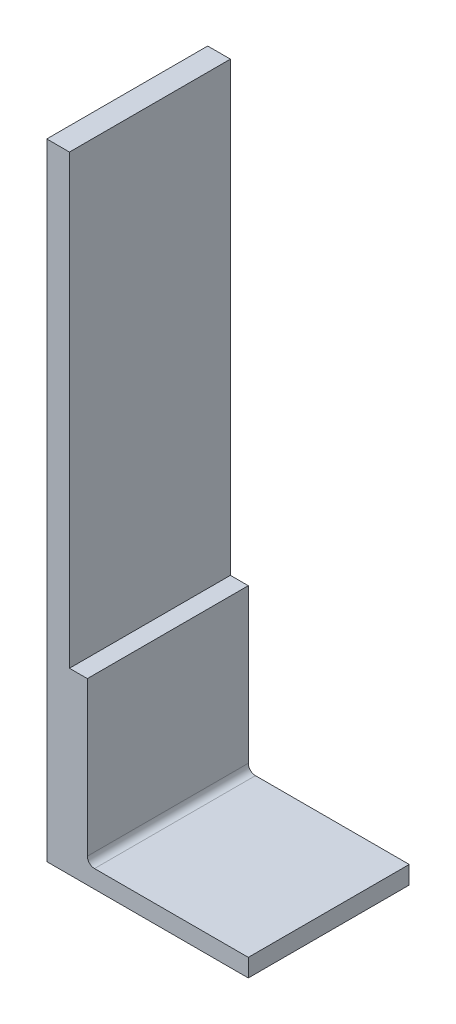
ISO-10303-21;
HEADER;
FILE_DESCRIPTION(('STEP AP214'),'2;1');
FILE_NAME('part.step','',(''),(''),'','','');
FILE_SCHEMA(('AUTOMOTIVE_DESIGN { 1 0 10303 214 1 1 1 1 }'));
ENDSEC;
DATA;
#1=APPLICATION_CONTEXT('core data for automotive mechanical design processes');
#2=APPLICATION_PROTOCOL_DEFINITION('international standard','automotive_design',2000,#1);
#3=PRODUCT_CONTEXT('',#1,'mechanical');
#4=PRODUCT('Part','Part','',(#3));
#5=PRODUCT_RELATED_PRODUCT_CATEGORY('part','',(#4));
#6=PRODUCT_DEFINITION_FORMATION('','',#4);
#7=PRODUCT_DEFINITION_CONTEXT('part definition',#1,'design');
#8=PRODUCT_DEFINITION('design','',#6,#7);
#9=PRODUCT_DEFINITION_SHAPE('','',#8);
#10=(LENGTH_UNIT() NAMED_UNIT(*) SI_UNIT(.MILLI.,.METRE.));
#11=(NAMED_UNIT(*) PLANE_ANGLE_UNIT() SI_UNIT($,.RADIAN.));
#12=(NAMED_UNIT(*) SI_UNIT($,.STERADIAN.) SOLID_ANGLE_UNIT());
#13=UNCERTAINTY_MEASURE_WITH_UNIT(LENGTH_MEASURE(1.E-05),#10,'distance_accuracy_value','');
#14=(GEOMETRIC_REPRESENTATION_CONTEXT(3) GLOBAL_UNCERTAINTY_ASSIGNED_CONTEXT((#13)) GLOBAL_UNIT_ASSIGNED_CONTEXT((#10,
#11,#12)) REPRESENTATION_CONTEXT('',''));
#15=CARTESIAN_POINT('',(0.,0.,0.));
#16=DIRECTION('',(0.,0.,1.));
#17=DIRECTION('',(1.,0.,0.));
#18=AXIS2_PLACEMENT_3D('',#15,#16,#17);
#19=CARTESIAN_POINT('',(0.,0.,90.));
#20=DIRECTION('',(0.,1.,0.));
#21=DIRECTION('',(0.,0.,1.));
#22=AXIS2_PLACEMENT_3D('',#19,#20,#21);
#23=PLANE('',#22);
#24=DIRECTION('',(1.,0.,0.));
#25=VECTOR('',#24,1.);
#26=CARTESIAN_POINT('',(0.,0.,0.));
#27=LINE('',#26,#25);
#28=CARTESIAN_POINT('',(-12.7,0.,0.));
#29=VERTEX_POINT('',#28);
#30=CARTESIAN_POINT('',(100.,0.,0.));
#31=VERTEX_POINT('',#30);
#32=EDGE_CURVE('E114',#29,#31,#27,.T.);
#33=ORIENTED_EDGE('',*,*,#32,.T.);
#34=DIRECTION('',(0.,0.,-1.));
#35=VECTOR('',#34,1.);
#36=CARTESIAN_POINT('',(100.,0.,90.));
#37=LINE('',#36,#35);
#38=CARTESIAN_POINT('',(100.,0.,90.));
#39=VERTEX_POINT('',#38);
#40=EDGE_CURVE('E11',#39,#31,#37,.T.);
#41=ORIENTED_EDGE('',*,*,#40,.F.);
#42=DIRECTION('',(1.,0.,0.));
#43=VECTOR('',#42,1.);
#44=CARTESIAN_POINT('',(0.,0.,90.));
#45=LINE('',#44,#43);
#46=CARTESIAN_POINT('',(-12.7,0.,90.));
#47=VERTEX_POINT('',#46);
#48=EDGE_CURVE('E127',#47,#39,#45,.T.);
#49=ORIENTED_EDGE('',*,*,#48,.F.);
#50=DIRECTION('',(0.,0.,1.));
#51=VECTOR('',#50,1.);
#52=CARTESIAN_POINT('',(-12.7,0.,0.));
#53=LINE('',#52,#51);
#54=EDGE_CURVE('E210',#29,#47,#53,.T.);
#55=ORIENTED_EDGE('',*,*,#54,.F.);
#56=EDGE_LOOP('',(#33,#41,#49,#55));
#57=FACE_BOUND('',#56,.T.);
#58=ADVANCED_FACE('F33',(#57),#23,.F.);
#59=CARTESIAN_POINT('',(100.,0.,90.));
#60=DIRECTION('',(-1.,0.,0.));
#61=DIRECTION('',(0.,0.,1.));
#62=AXIS2_PLACEMENT_3D('',#59,#60,#61);
#63=PLANE('',#62);
#64=DIRECTION('',(0.,1.,0.));
#65=VECTOR('',#64,1.);
#66=CARTESIAN_POINT('',(100.,0.,0.));
#67=LINE('',#66,#65);
#68=CARTESIAN_POINT('',(100.,10.,0.));
#69=VERTEX_POINT('',#68);
#70=EDGE_CURVE('E117',#31,#69,#67,.T.);
#71=ORIENTED_EDGE('',*,*,#70,.T.);
#72=DIRECTION('',(0.,0.,-1.));
#73=VECTOR('',#72,1.);
#74=CARTESIAN_POINT('',(100.,10.,90.));
#75=LINE('',#74,#73);
#76=CARTESIAN_POINT('',(100.,10.,90.));
#77=VERTEX_POINT('',#76);
#78=EDGE_CURVE('E41',#77,#69,#75,.T.);
#79=ORIENTED_EDGE('',*,*,#78,.F.);
#80=DIRECTION('',(0.,1.,0.));
#81=VECTOR('',#80,1.);
#82=CARTESIAN_POINT('',(100.,0.,90.));
#83=LINE('',#82,#81);
#84=EDGE_CURVE('E85',#39,#77,#83,.T.);
#85=ORIENTED_EDGE('',*,*,#84,.F.);
#86=ORIENTED_EDGE('',*,*,#40,.T.);
#87=EDGE_LOOP('',(#71,#79,#85,#86));
#88=FACE_BOUND('',#87,.T.);
#89=ADVANCED_FACE('F177',(#88),#63,.F.);
#90=CARTESIAN_POINT('',(14.,10.,90.));
#91=DIRECTION('',(0.,-1.,0.));
#92=DIRECTION('',(0.,0.,-1.));
#93=AXIS2_PLACEMENT_3D('',#90,#91,#92);
#94=PLANE('',#93);
#95=DIRECTION('',(-1.,0.,0.));
#96=VECTOR('',#95,1.);
#97=CARTESIAN_POINT('',(14.,10.,0.));
#98=LINE('',#97,#96);
#99=CARTESIAN_POINT('',(14.,10.,0.));
#100=VERTEX_POINT('',#99);
#101=EDGE_CURVE('E120',#69,#100,#98,.T.);
#102=ORIENTED_EDGE('',*,*,#101,.T.);
#103=DIRECTION('',(0.,0.,-1.));
#104=VECTOR('',#103,1.);
#105=CARTESIAN_POINT('',(14.,10.,90.));
#106=LINE('',#105,#104);
#107=CARTESIAN_POINT('',(14.,10.,90.));
#108=VERTEX_POINT('',#107);
#109=EDGE_CURVE('E105',#108,#100,#106,.T.);
#110=ORIENTED_EDGE('',*,*,#109,.F.);
#111=DIRECTION('',(-1.,0.,0.));
#112=VECTOR('',#111,1.);
#113=CARTESIAN_POINT('',(14.,10.,90.));
#114=LINE('',#113,#112);
#115=EDGE_CURVE('E100',#77,#108,#114,.T.);
#116=ORIENTED_EDGE('',*,*,#115,.F.);
#117=ORIENTED_EDGE('',*,*,#78,.T.);
#118=EDGE_LOOP('',(#102,#110,#116,#117));
#119=FACE_BOUND('',#118,.T.);
#120=ADVANCED_FACE('F134',(#119),#94,.F.);
#121=CARTESIAN_POINT('',(14.,14.,90.));
#122=DIRECTION('',(0.,0.,-1.));
#123=DIRECTION('',(-1.,0.,0.));
#124=AXIS2_PLACEMENT_3D('',#121,#122,#123);
#125=CYLINDRICAL_SURFACE('',#124,4.);
#126=CARTESIAN_POINT('',(14.,14.,0.));
#127=DIRECTION('',(0.,0.,-1.));
#128=DIRECTION('',(1.,0.,0.));
#129=AXIS2_PLACEMENT_3D('',#126,#127,#128);
#130=CIRCLE('',#129,4.);
#131=CARTESIAN_POINT('',(10.,14.,0.));
#132=VERTEX_POINT('',#131);
#133=EDGE_CURVE('E70',#100,#132,#130,.T.);
#134=ORIENTED_EDGE('',*,*,#133,.T.);
#135=DIRECTION('',(0.,0.,-1.));
#136=VECTOR('',#135,1.);
#137=CARTESIAN_POINT('',(10.,14.,90.));
#138=LINE('',#137,#136);
#139=CARTESIAN_POINT('',(10.,14.,90.));
#140=VERTEX_POINT('',#139);
#141=EDGE_CURVE('E103',#140,#132,#138,.T.);
#142=ORIENTED_EDGE('',*,*,#141,.F.);
#143=CARTESIAN_POINT('',(14.,14.,90.));
#144=DIRECTION('',(0.,0.,-1.));
#145=DIRECTION('',(1.,0.,0.));
#146=AXIS2_PLACEMENT_3D('',#143,#144,#145);
#147=CIRCLE('',#146,4.);
#148=EDGE_CURVE('E95',#108,#140,#147,.T.);
#149=ORIENTED_EDGE('',*,*,#148,.F.);
#150=ORIENTED_EDGE('',*,*,#109,.T.);
#151=EDGE_LOOP('',(#134,#142,#149,#150));
#152=FACE_BOUND('',#151,.T.);
#153=ADVANCED_FACE('F104',(#152),#125,.F.);
#154=CARTESIAN_POINT('',(10.,14.,90.));
#155=DIRECTION('',(-1.,0.,0.));
#156=DIRECTION('',(0.,0.,1.));
#157=AXIS2_PLACEMENT_3D('',#154,#155,#156);
#158=PLANE('',#157);
#159=DIRECTION('',(0.,1.,0.));
#160=VECTOR('',#159,1.);
#161=CARTESIAN_POINT('',(10.,14.,0.));
#162=LINE('',#161,#160);
#163=CARTESIAN_POINT('',(10.,100.,0.));
#164=VERTEX_POINT('',#163);
#165=EDGE_CURVE('E77',#132,#164,#162,.T.);
#166=ORIENTED_EDGE('',*,*,#165,.T.);
#167=DIRECTION('',(0.,0.,-1.));
#168=VECTOR('',#167,1.);
#169=CARTESIAN_POINT('',(10.,100.,90.));
#170=LINE('',#169,#168);
#171=CARTESIAN_POINT('',(10.,100.,90.));
#172=VERTEX_POINT('',#171);
#173=EDGE_CURVE('E106',#172,#164,#170,.T.);
#174=ORIENTED_EDGE('',*,*,#173,.F.);
#175=DIRECTION('',(0.,1.,0.));
#176=VECTOR('',#175,1.);
#177=CARTESIAN_POINT('',(10.,14.,90.));
#178=LINE('',#177,#176);
#179=EDGE_CURVE('E98',#140,#172,#178,.T.);
#180=ORIENTED_EDGE('',*,*,#179,.F.);
#181=ORIENTED_EDGE('',*,*,#141,.T.);
#182=EDGE_LOOP('',(#166,#174,#180,#181));
#183=FACE_BOUND('',#182,.T.);
#184=ADVANCED_FACE('F108',(#183),#158,.F.);
#185=CARTESIAN_POINT('',(0.,100.,90.));
#186=DIRECTION('',(0.,-1.,0.));
#187=DIRECTION('',(0.,0.,-1.));
#188=AXIS2_PLACEMENT_3D('',#185,#186,#187);
#189=PLANE('',#188);
#190=DIRECTION('',(-1.,0.,0.));
#191=VECTOR('',#190,1.);
#192=CARTESIAN_POINT('',(0.,100.,0.));
#193=LINE('',#192,#191);
#194=CARTESIAN_POINT('',(0.,100.,0.));
#195=VERTEX_POINT('',#194);
#196=EDGE_CURVE('E124',#164,#195,#193,.T.);
#197=ORIENTED_EDGE('',*,*,#196,.T.);
#198=DIRECTION('',(0.,0.,-1.));
#199=VECTOR('',#198,1.);
#200=CARTESIAN_POINT('',(0.,100.,90.));
#201=LINE('',#200,#199);
#202=CARTESIAN_POINT('',(0.,100.,90.));
#203=VERTEX_POINT('',#202);
#204=EDGE_CURVE('E110',#203,#195,#201,.T.);
#205=ORIENTED_EDGE('',*,*,#204,.F.);
#206=DIRECTION('',(-1.,0.,0.));
#207=VECTOR('',#206,1.);
#208=CARTESIAN_POINT('',(0.,100.,90.));
#209=LINE('',#208,#207);
#210=EDGE_CURVE('E49',#172,#203,#209,.T.);
#211=ORIENTED_EDGE('',*,*,#210,.F.);
#212=ORIENTED_EDGE('',*,*,#173,.T.);
#213=EDGE_LOOP('',(#197,#205,#211,#212));
#214=FACE_BOUND('',#213,.T.);
#215=ADVANCED_FACE('F144',(#214),#189,.F.);
#216=CARTESIAN_POINT('',(14.,14.,90.));
#217=DIRECTION('',(0.,0.,1.));
#218=DIRECTION('',(1.,0.,0.));
#219=AXIS2_PLACEMENT_3D('',#216,#217,#218);
#220=PLANE('',#219);
#221=ORIENTED_EDGE('',*,*,#48,.T.);
#222=ORIENTED_EDGE('',*,*,#84,.T.);
#223=ORIENTED_EDGE('',*,*,#115,.T.);
#224=ORIENTED_EDGE('',*,*,#148,.T.);
#225=ORIENTED_EDGE('',*,*,#179,.T.);
#226=ORIENTED_EDGE('',*,*,#210,.T.);
#227=DIRECTION('',(0.,1.,0.));
#228=VECTOR('',#227,1.);
#229=CARTESIAN_POINT('',(0.,0.,90.));
#230=LINE('',#229,#228);
#231=CARTESIAN_POINT('',(0.,350.,90.));
#232=VERTEX_POINT('',#231);
#233=EDGE_CURVE('E151',#203,#232,#230,.T.);
#234=ORIENTED_EDGE('',*,*,#233,.T.);
#235=DIRECTION('',(1.,0.,0.));
#236=VECTOR('',#235,1.);
#237=CARTESIAN_POINT('',(-12.7,350.,90.));
#238=LINE('',#237,#236);
#239=CARTESIAN_POINT('',(-12.7,350.,90.));
#240=VERTEX_POINT('',#239);
#241=EDGE_CURVE('E118',#240,#232,#238,.T.);
#242=ORIENTED_EDGE('',*,*,#241,.F.);
#243=DIRECTION('',(0.,1.,0.));
#244=VECTOR('',#243,1.);
#245=CARTESIAN_POINT('',(-12.7,0.,90.));
#246=LINE('',#245,#244);
#247=EDGE_CURVE('E173',#47,#240,#246,.T.);
#248=ORIENTED_EDGE('',*,*,#247,.F.);
#249=EDGE_LOOP('',(#221,#222,#223,#224,#225,#226,#234,#242,#248));
#250=FACE_BOUND('',#249,.T.);
#251=ADVANCED_FACE('F96',(#250),#220,.T.);
#252=CARTESIAN_POINT('',(14.,14.,0.));
#253=DIRECTION('',(0.,0.,1.));
#254=DIRECTION('',(1.,0.,0.));
#255=AXIS2_PLACEMENT_3D('',#252,#253,#254);
#256=PLANE('',#255);
#257=ORIENTED_EDGE('',*,*,#32,.F.);
#258=DIRECTION('',(0.,-1.,0.));
#259=VECTOR('',#258,1.);
#260=CARTESIAN_POINT('',(-12.7,0.,0.));
#261=LINE('',#260,#259);
#262=CARTESIAN_POINT('',(-12.7,350.,0.));
#263=VERTEX_POINT('',#262);
#264=EDGE_CURVE('E158',#263,#29,#261,.T.);
#265=ORIENTED_EDGE('',*,*,#264,.F.);
#266=DIRECTION('',(1.,0.,0.));
#267=VECTOR('',#266,1.);
#268=CARTESIAN_POINT('',(-12.7,350.,0.));
#269=LINE('',#268,#267);
#270=CARTESIAN_POINT('',(0.,350.,0.));
#271=VERTEX_POINT('',#270);
#272=EDGE_CURVE('E163',#263,#271,#269,.T.);
#273=ORIENTED_EDGE('',*,*,#272,.T.);
#274=DIRECTION('',(0.,-1.,0.));
#275=VECTOR('',#274,1.);
#276=CARTESIAN_POINT('',(0.,0.,0.));
#277=LINE('',#276,#275);
#278=EDGE_CURVE('E142',#271,#195,#277,.T.);
#279=ORIENTED_EDGE('',*,*,#278,.T.);
#280=ORIENTED_EDGE('',*,*,#196,.F.);
#281=ORIENTED_EDGE('',*,*,#165,.F.);
#282=ORIENTED_EDGE('',*,*,#133,.F.);
#283=ORIENTED_EDGE('',*,*,#101,.F.);
#284=ORIENTED_EDGE('',*,*,#70,.F.);
#285=EDGE_LOOP('',(#257,#265,#273,#279,#280,#281,#282,#283,#284));
#286=FACE_BOUND('',#285,.T.);
#287=ADVANCED_FACE('F137',(#286),#256,.F.);
#288=CARTESIAN_POINT('',(-12.7,350.,0.));
#289=DIRECTION('',(0.,-1.,0.));
#290=DIRECTION('',(0.,0.,-1.));
#291=AXIS2_PLACEMENT_3D('',#288,#289,#290);
#292=PLANE('',#291);
#293=DIRECTION('',(0.,0.,-1.));
#294=VECTOR('',#293,1.);
#295=CARTESIAN_POINT('',(0.,350.,0.));
#296=LINE('',#295,#294);
#297=EDGE_CURVE('E154',#232,#271,#296,.T.);
#298=ORIENTED_EDGE('',*,*,#297,.T.);
#299=ORIENTED_EDGE('',*,*,#272,.F.);
#300=DIRECTION('',(0.,0.,-1.));
#301=VECTOR('',#300,1.);
#302=CARTESIAN_POINT('',(-12.7,350.,0.));
#303=LINE('',#302,#301);
#304=EDGE_CURVE('E165',#240,#263,#303,.T.);
#305=ORIENTED_EDGE('',*,*,#304,.F.);
#306=ORIENTED_EDGE('',*,*,#241,.T.);
#307=EDGE_LOOP('',(#298,#299,#305,#306));
#308=FACE_BOUND('',#307,.T.);
#309=ADVANCED_FACE('F193',(#308),#292,.F.);
#310=CARTESIAN_POINT('',(-12.7,0.,0.));
#311=DIRECTION('',(1.,0.,0.));
#312=DIRECTION('',(0.,0.,-1.));
#313=AXIS2_PLACEMENT_3D('',#310,#311,#312);
#314=PLANE('',#313);
#315=ORIENTED_EDGE('',*,*,#264,.T.);
#316=ORIENTED_EDGE('',*,*,#54,.T.);
#317=ORIENTED_EDGE('',*,*,#247,.T.);
#318=ORIENTED_EDGE('',*,*,#304,.T.);
#319=EDGE_LOOP('',(#315,#316,#317,#318));
#320=FACE_BOUND('',#319,.T.);
#321=ADVANCED_FACE('F198',(#320),#314,.F.);
#322=CARTESIAN_POINT('',(0.,0.,0.));
#323=DIRECTION('',(1.,0.,0.));
#324=DIRECTION('',(0.,0.,-1.));
#325=AXIS2_PLACEMENT_3D('',#322,#323,#324);
#326=PLANE('',#325);
#327=ORIENTED_EDGE('',*,*,#233,.F.);
#328=ORIENTED_EDGE('',*,*,#204,.T.);
#329=ORIENTED_EDGE('',*,*,#278,.F.);
#330=ORIENTED_EDGE('',*,*,#297,.F.);
#331=EDGE_LOOP('',(#327,#328,#329,#330));
#332=FACE_BOUND('',#331,.T.);
#333=ADVANCED_FACE('F148',(#332),#326,.T.);
#334=CLOSED_SHELL('',(#58,#89,#120,#153,#184,#215,#251,#287,#309,#321,#333));
#335=MANIFOLD_SOLID_BREP('B2',#334);
#336=ADVANCED_BREP_SHAPE_REPRESENTATION('',(#18,#335),#14);
#337=SHAPE_DEFINITION_REPRESENTATION(#9,#336);
ENDSEC;
END-ISO-10303-21;
